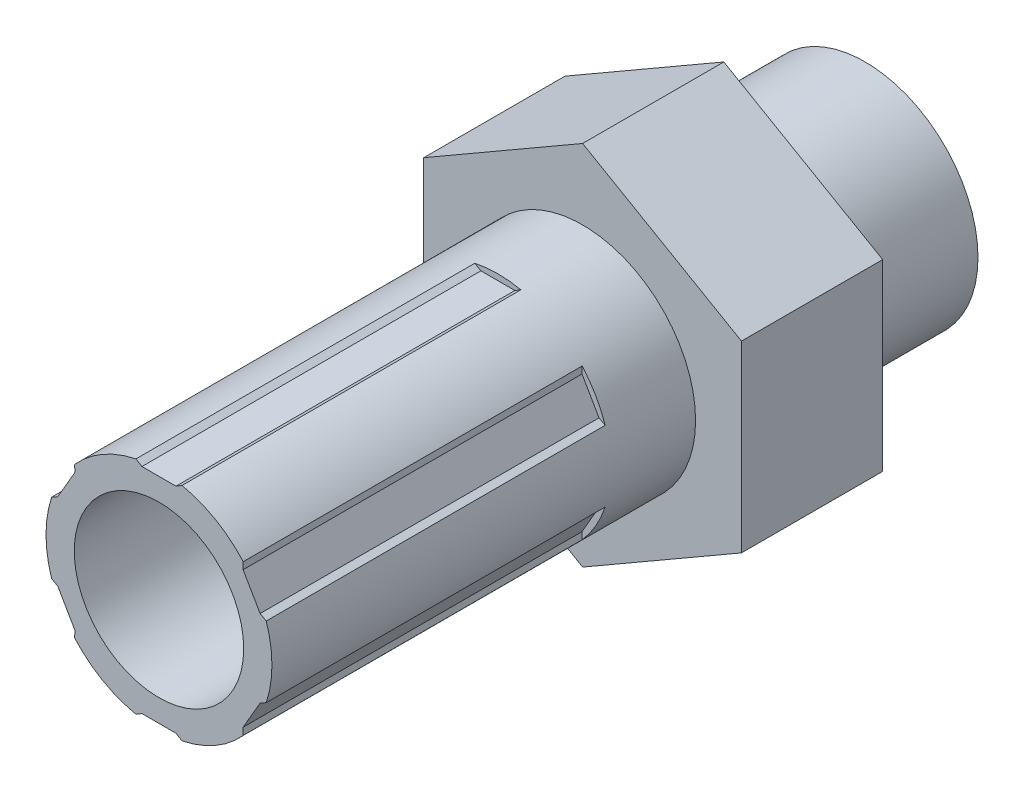
ISO-10303-21;
HEADER;
FILE_DESCRIPTION(('STEP AP214'),'2;1');
FILE_NAME('part.step','',(''),(''),'','','');
FILE_SCHEMA(('AUTOMOTIVE_DESIGN { 1 0 10303 214 1 1 1 1 }'));
ENDSEC;
DATA;
#1=APPLICATION_CONTEXT('core data for automotive mechanical design processes');
#2=APPLICATION_PROTOCOL_DEFINITION('international standard','automotive_design',2000,#1);
#3=PRODUCT_CONTEXT('',#1,'mechanical');
#4=PRODUCT('Part','Part','',(#3));
#5=PRODUCT_RELATED_PRODUCT_CATEGORY('part','',(#4));
#6=PRODUCT_DEFINITION_FORMATION('','',#4);
#7=PRODUCT_DEFINITION_CONTEXT('part definition',#1,'design');
#8=PRODUCT_DEFINITION('design','',#6,#7);
#9=PRODUCT_DEFINITION_SHAPE('','',#8);
#10=(LENGTH_UNIT() NAMED_UNIT(*) SI_UNIT(.MILLI.,.METRE.));
#11=(NAMED_UNIT(*) PLANE_ANGLE_UNIT() SI_UNIT($,.RADIAN.));
#12=(NAMED_UNIT(*) SI_UNIT($,.STERADIAN.) SOLID_ANGLE_UNIT());
#13=UNCERTAINTY_MEASURE_WITH_UNIT(LENGTH_MEASURE(1.E-05),#10,'distance_accuracy_value','');
#14=(GEOMETRIC_REPRESENTATION_CONTEXT(3) GLOBAL_UNCERTAINTY_ASSIGNED_CONTEXT((#13)) GLOBAL_UNIT_ASSIGNED_CONTEXT((#10,
#11,#12)) REPRESENTATION_CONTEXT('',''));
#15=CARTESIAN_POINT('',(0.,0.,0.));
#16=DIRECTION('',(0.,0.,1.));
#17=DIRECTION('',(1.,0.,0.));
#18=AXIS2_PLACEMENT_3D('',#15,#16,#17);
#19=CARTESIAN_POINT('',(0.,8.24889197104678,6.35));
#20=DIRECTION('',(0.,0.,1.));
#21=DIRECTION('',(1.,0.,0.));
#22=AXIS2_PLACEMENT_3D('',#19,#20,#21);
#23=PLANE('',#22);
#24=DIRECTION('',(-0.866025403784439,0.5,0.));
#25=VECTOR('',#24,1.);
#26=CARTESIAN_POINT('',(7.14375,4.12444598552339,6.35));
#27=LINE('',#26,#25);
#28=CARTESIAN_POINT('',(7.14375,4.12444598552339,6.35));
#29=VERTEX_POINT('',#28);
#30=CARTESIAN_POINT('',(0.,8.24889197104678,6.35));
#31=VERTEX_POINT('',#30);
#32=EDGE_CURVE('E386',#29,#31,#27,.T.);
#33=ORIENTED_EDGE('',*,*,#32,.T.);
#34=DIRECTION('',(-0.866025403784438,-0.5,0.));
#35=VECTOR('',#34,1.);
#36=CARTESIAN_POINT('',(0.,8.24889197104678,6.35));
#37=LINE('',#36,#35);
#38=CARTESIAN_POINT('',(-7.14375,4.12444598552338,6.35));
#39=VERTEX_POINT('',#38);
#40=EDGE_CURVE('E389',#31,#39,#37,.T.);
#41=ORIENTED_EDGE('',*,*,#40,.T.);
#42=DIRECTION('',(0.,-1.,0.));
#43=VECTOR('',#42,1.);
#44=CARTESIAN_POINT('',(-7.14375,4.12444598552338,6.35));
#45=LINE('',#44,#43);
#46=CARTESIAN_POINT('',(-7.14375,-4.12444598552339,6.35));
#47=VERTEX_POINT('',#46);
#48=EDGE_CURVE('E392',#39,#47,#45,.T.);
#49=ORIENTED_EDGE('',*,*,#48,.T.);
#50=DIRECTION('',(0.866025403784439,-0.5,0.));
#51=VECTOR('',#50,1.);
#52=CARTESIAN_POINT('',(-7.14375,-4.12444598552339,6.35));
#53=LINE('',#52,#51);
#54=CARTESIAN_POINT('',(0.,-8.24889197104678,6.35));
#55=VERTEX_POINT('',#54);
#56=EDGE_CURVE('E394',#47,#55,#53,.T.);
#57=ORIENTED_EDGE('',*,*,#56,.T.);
#58=DIRECTION('',(0.866025403784439,0.5,0.));
#59=VECTOR('',#58,1.);
#60=CARTESIAN_POINT('',(0.,-8.24889197104678,6.35));
#61=LINE('',#60,#59);
#62=CARTESIAN_POINT('',(7.14375,-4.12444598552339,6.35));
#63=VERTEX_POINT('',#62);
#64=EDGE_CURVE('E396',#55,#63,#61,.T.);
#65=ORIENTED_EDGE('',*,*,#64,.T.);
#66=DIRECTION('',(0.,1.,0.));
#67=VECTOR('',#66,1.);
#68=CARTESIAN_POINT('',(7.14375,-4.12444598552339,6.35));
#69=LINE('',#68,#67);
#70=EDGE_CURVE('E398',#63,#29,#69,.T.);
#71=ORIENTED_EDGE('',*,*,#70,.T.);
#72=EDGE_LOOP('',(#33,#41,#49,#57,#65,#71));
#73=FACE_BOUND('',#72,.T.);
#74=CARTESIAN_POINT('',(0.,0.,6.35));
#75=DIRECTION('',(0.,0.,1.));
#76=DIRECTION('',(1.,0.,0.));
#77=AXIS2_PLACEMENT_3D('',#74,#75,#76);
#78=CIRCLE('',#77,5.08);
#79=CARTESIAN_POINT('',(5.08,0.,6.35));
#80=VERTEX_POINT('',#79);
#81=EDGE_CURVE('E372',#80,#80,#78,.T.);
#82=ORIENTED_EDGE('',*,*,#81,.F.);
#83=EDGE_LOOP('',(#82));
#84=FACE_BOUND('',#83,.T.);
#85=ADVANCED_FACE('F30',(#73,#84),#23,.T.);
#86=CARTESIAN_POINT('',(0.,8.24889197104678,0.));
#87=DIRECTION('',(0.,0.,1.));
#88=DIRECTION('',(1.,0.,0.));
#89=AXIS2_PLACEMENT_3D('',#86,#87,#88);
#90=PLANE('',#89);
#91=DIRECTION('',(-0.866025403784439,0.5,0.));
#92=VECTOR('',#91,1.);
#93=CARTESIAN_POINT('',(7.14375,4.12444598552339,0.));
#94=LINE('',#93,#92);
#95=CARTESIAN_POINT('',(7.14375,4.12444598552339,0.));
#96=VERTEX_POINT('',#95);
#97=CARTESIAN_POINT('',(0.,8.24889197104678,0.));
#98=VERTEX_POINT('',#97);
#99=EDGE_CURVE('E385',#96,#98,#94,.T.);
#100=ORIENTED_EDGE('',*,*,#99,.F.);
#101=DIRECTION('',(0.,1.,0.));
#102=VECTOR('',#101,1.);
#103=CARTESIAN_POINT('',(7.14375,-4.12444598552339,0.));
#104=LINE('',#103,#102);
#105=CARTESIAN_POINT('',(7.14375,-4.12444598552339,0.));
#106=VERTEX_POINT('',#105);
#107=EDGE_CURVE('E390',#106,#96,#104,.T.);
#108=ORIENTED_EDGE('',*,*,#107,.F.);
#109=DIRECTION('',(0.866025403784439,0.5,0.));
#110=VECTOR('',#109,1.);
#111=CARTESIAN_POINT('',(0.,-8.24889197104678,0.));
#112=LINE('',#111,#110);
#113=CARTESIAN_POINT('',(0.,-8.24889197104678,0.));
#114=VERTEX_POINT('',#113);
#115=EDGE_CURVE('E409',#114,#106,#112,.T.);
#116=ORIENTED_EDGE('',*,*,#115,.F.);
#117=DIRECTION('',(0.866025403784439,-0.5,0.));
#118=VECTOR('',#117,1.);
#119=CARTESIAN_POINT('',(-7.14375,-4.12444598552339,0.));
#120=LINE('',#119,#118);
#121=CARTESIAN_POINT('',(-7.14375,-4.12444598552339,0.));
#122=VERTEX_POINT('',#121);
#123=EDGE_CURVE('E407',#122,#114,#120,.T.);
#124=ORIENTED_EDGE('',*,*,#123,.F.);
#125=DIRECTION('',(0.,-1.,0.));
#126=VECTOR('',#125,1.);
#127=CARTESIAN_POINT('',(-7.14375,4.12444598552338,0.));
#128=LINE('',#127,#126);
#129=CARTESIAN_POINT('',(-7.14375,4.12444598552338,0.));
#130=VERTEX_POINT('',#129);
#131=EDGE_CURVE('E405',#130,#122,#128,.T.);
#132=ORIENTED_EDGE('',*,*,#131,.F.);
#133=DIRECTION('',(-0.866025403784438,-0.5,0.));
#134=VECTOR('',#133,1.);
#135=CARTESIAN_POINT('',(0.,8.24889197104678,0.));
#136=LINE('',#135,#134);
#137=EDGE_CURVE('E403',#98,#130,#136,.T.);
#138=ORIENTED_EDGE('',*,*,#137,.F.);
#139=EDGE_LOOP('',(#100,#108,#116,#124,#132,#138));
#140=FACE_BOUND('',#139,.T.);
#141=CARTESIAN_POINT('',(0.,0.,0.));
#142=DIRECTION('',(0.,0.,1.));
#143=DIRECTION('',(1.,0.,0.));
#144=AXIS2_PLACEMENT_3D('',#141,#142,#143);
#145=CIRCLE('',#144,5.08);
#146=CARTESIAN_POINT('',(5.08,0.,0.));
#147=VERTEX_POINT('',#146);
#148=EDGE_CURVE('E429',#147,#147,#145,.F.);
#149=ORIENTED_EDGE('',*,*,#148,.F.);
#150=EDGE_LOOP('',(#149));
#151=FACE_BOUND('',#150,.T.);
#152=ADVANCED_FACE('F536',(#140,#151),#90,.F.);
#153=CARTESIAN_POINT('',(7.14375,4.12444598552339,6.35));
#154=DIRECTION('',(-0.5,-0.866025403784439,0.));
#155=DIRECTION('',(0.866025403784439,-0.5,0.));
#156=AXIS2_PLACEMENT_3D('',#153,#154,#155);
#157=PLANE('',#156);
#158=ORIENTED_EDGE('',*,*,#99,.T.);
#159=DIRECTION('',(0.,0.,-1.));
#160=VECTOR('',#159,1.);
#161=CARTESIAN_POINT('',(0.,8.24889197104678,6.35));
#162=LINE('',#161,#160);
#163=EDGE_CURVE('E426',#31,#98,#162,.T.);
#164=ORIENTED_EDGE('',*,*,#163,.F.);
#165=ORIENTED_EDGE('',*,*,#32,.F.);
#166=DIRECTION('',(0.,0.,-1.));
#167=VECTOR('',#166,1.);
#168=CARTESIAN_POINT('',(7.14375,4.12444598552339,6.35));
#169=LINE('',#168,#167);
#170=EDGE_CURVE('E400',#29,#96,#169,.T.);
#171=ORIENTED_EDGE('',*,*,#170,.T.);
#172=EDGE_LOOP('',(#158,#164,#165,#171));
#173=FACE_BOUND('',#172,.T.);
#174=ADVANCED_FACE('F32',(#173),#157,.F.);
#175=CARTESIAN_POINT('',(0.,8.24889197104678,6.35));
#176=DIRECTION('',(0.5,-0.866025403784438,0.));
#177=DIRECTION('',(0.866025403784438,0.500000000000001,0.));
#178=AXIS2_PLACEMENT_3D('',#175,#176,#177);
#179=PLANE('',#178);
#180=ORIENTED_EDGE('',*,*,#137,.T.);
#181=DIRECTION('',(0.,0.,-1.));
#182=VECTOR('',#181,1.);
#183=CARTESIAN_POINT('',(-7.14375,4.12444598552338,6.35));
#184=LINE('',#183,#182);
#185=EDGE_CURVE('E423',#39,#130,#184,.T.);
#186=ORIENTED_EDGE('',*,*,#185,.F.);
#187=ORIENTED_EDGE('',*,*,#40,.F.);
#188=ORIENTED_EDGE('',*,*,#163,.T.);
#189=EDGE_LOOP('',(#180,#186,#187,#188));
#190=FACE_BOUND('',#189,.T.);
#191=ADVANCED_FACE('F563',(#190),#179,.F.);
#192=CARTESIAN_POINT('',(-7.14375,4.12444598552338,6.35));
#193=DIRECTION('',(1.,0.,0.));
#194=DIRECTION('',(0.,0.,-1.));
#195=AXIS2_PLACEMENT_3D('',#192,#193,#194);
#196=PLANE('',#195);
#197=ORIENTED_EDGE('',*,*,#131,.T.);
#198=DIRECTION('',(0.,0.,-1.));
#199=VECTOR('',#198,1.);
#200=CARTESIAN_POINT('',(-7.14375,-4.12444598552339,6.35));
#201=LINE('',#200,#199);
#202=EDGE_CURVE('E420',#47,#122,#201,.T.);
#203=ORIENTED_EDGE('',*,*,#202,.F.);
#204=ORIENTED_EDGE('',*,*,#48,.F.);
#205=ORIENTED_EDGE('',*,*,#185,.T.);
#206=EDGE_LOOP('',(#197,#203,#204,#205));
#207=FACE_BOUND('',#206,.T.);
#208=ADVANCED_FACE('F560',(#207),#196,.F.);
#209=CARTESIAN_POINT('',(-7.14375,-4.12444598552339,6.35));
#210=DIRECTION('',(0.5,0.866025403784439,0.));
#211=DIRECTION('',(-0.866025403784439,0.5,0.));
#212=AXIS2_PLACEMENT_3D('',#209,#210,#211);
#213=PLANE('',#212);
#214=ORIENTED_EDGE('',*,*,#123,.T.);
#215=DIRECTION('',(0.,0.,-1.));
#216=VECTOR('',#215,1.);
#217=CARTESIAN_POINT('',(0.,-8.24889197104678,6.35));
#218=LINE('',#217,#216);
#219=EDGE_CURVE('E417',#55,#114,#218,.T.);
#220=ORIENTED_EDGE('',*,*,#219,.F.);
#221=ORIENTED_EDGE('',*,*,#56,.F.);
#222=ORIENTED_EDGE('',*,*,#202,.T.);
#223=EDGE_LOOP('',(#214,#220,#221,#222));
#224=FACE_BOUND('',#223,.T.);
#225=ADVANCED_FACE('F556',(#224),#213,.F.);
#226=CARTESIAN_POINT('',(0.,-8.24889197104678,6.35));
#227=DIRECTION('',(-0.5,0.866025403784439,0.));
#228=DIRECTION('',(-0.866025403784439,-0.5,0.));
#229=AXIS2_PLACEMENT_3D('',#226,#227,#228);
#230=PLANE('',#229);
#231=ORIENTED_EDGE('',*,*,#115,.T.);
#232=DIRECTION('',(0.,0.,-1.));
#233=VECTOR('',#232,1.);
#234=CARTESIAN_POINT('',(7.14375,-4.12444598552339,6.35));
#235=LINE('',#234,#233);
#236=EDGE_CURVE('E414',#63,#106,#235,.T.);
#237=ORIENTED_EDGE('',*,*,#236,.F.);
#238=ORIENTED_EDGE('',*,*,#64,.F.);
#239=ORIENTED_EDGE('',*,*,#219,.T.);
#240=EDGE_LOOP('',(#231,#237,#238,#239));
#241=FACE_BOUND('',#240,.T.);
#242=ADVANCED_FACE('F552',(#241),#230,.F.);
#243=CARTESIAN_POINT('',(7.14375,-4.12444598552339,6.35));
#244=DIRECTION('',(-1.,0.,0.));
#245=DIRECTION('',(0.,-1.,0.));
#246=AXIS2_PLACEMENT_3D('',#243,#244,#245);
#247=PLANE('',#246);
#248=ORIENTED_EDGE('',*,*,#107,.T.);
#249=ORIENTED_EDGE('',*,*,#170,.F.);
#250=ORIENTED_EDGE('',*,*,#70,.F.);
#251=ORIENTED_EDGE('',*,*,#236,.T.);
#252=EDGE_LOOP('',(#248,#249,#250,#251));
#253=FACE_BOUND('',#252,.T.);
#254=ADVANCED_FACE('F549',(#253),#247,.F.);
#255=CARTESIAN_POINT('',(0.,0.,-6.35));
#256=DIRECTION('',(0.,0.,1.));
#257=DIRECTION('',(1.,0.,0.));
#258=AXIS2_PLACEMENT_3D('',#255,#256,#257);
#259=CYLINDRICAL_SURFACE('',#258,5.08);
#260=CARTESIAN_POINT('',(0.,0.,-6.35));
#261=DIRECTION('',(0.,0.,-1.));
#262=DIRECTION('',(-1.,0.,0.));
#263=AXIS2_PLACEMENT_3D('',#260,#261,#262);
#264=CIRCLE('',#263,5.08);
#265=CARTESIAN_POINT('',(-5.08,0.,-6.35));
#266=VERTEX_POINT('',#265);
#267=EDGE_CURVE('E378',#266,#266,#264,.T.);
#268=ORIENTED_EDGE('',*,*,#267,.F.);
#269=EDGE_LOOP('',(#268));
#270=FACE_BOUND('',#269,.T.);
#271=ORIENTED_EDGE('',*,*,#148,.T.);
#272=EDGE_LOOP('',(#271));
#273=FACE_BOUND('',#272,.T.);
#274=ADVANCED_FACE('F546',(#270,#273),#259,.T.);
#275=CARTESIAN_POINT('',(0.,0.,-6.35));
#276=DIRECTION('',(0.,0.,-1.));
#277=DIRECTION('',(-1.,0.,0.));
#278=AXIS2_PLACEMENT_3D('',#275,#276,#277);
#279=PLANE('',#278);
#280=CARTESIAN_POINT('',(0.,0.,-6.35));
#281=DIRECTION('',(0.,0.,1.));
#282=DIRECTION('',(1.,0.,0.));
#283=AXIS2_PLACEMENT_3D('',#280,#281,#282);
#284=CIRCLE('',#283,3.81);
#285=CARTESIAN_POINT('',(3.81,0.,-6.35));
#286=VERTEX_POINT('',#285);
#287=EDGE_CURVE('E369',#286,#286,#284,.T.);
#288=ORIENTED_EDGE('',*,*,#287,.T.);
#289=EDGE_LOOP('',(#288));
#290=FACE_BOUND('',#289,.T.);
#291=ORIENTED_EDGE('',*,*,#267,.T.);
#292=EDGE_LOOP('',(#291));
#293=FACE_BOUND('',#292,.T.);
#294=ADVANCED_FACE('F591',(#290,#293),#279,.T.);
#295=CARTESIAN_POINT('',(0.,0.,25.4));
#296=DIRECTION('',(0.,0.,-1.));
#297=DIRECTION('',(-1.,0.,0.));
#298=AXIS2_PLACEMENT_3D('',#295,#296,#297);
#299=CYLINDRICAL_SURFACE('',#298,5.08);
#300=CARTESIAN_POINT('',(0.,0.,25.4));
#301=DIRECTION('',(0.,0.,1.));
#302=DIRECTION('',(1.,0.,0.));
#303=AXIS2_PLACEMENT_3D('',#300,#301,#302);
#304=CIRCLE('',#303,5.08);
#305=CARTESIAN_POINT('',(3.78960210015848,3.38309265650151,25.4));
#306=VERTEX_POINT('',#305);
#307=CARTESIAN_POINT('',(1.03504313380759,4.97343801722287,25.4));
#308=VERTEX_POINT('',#307);
#309=EDGE_CURVE('E380',#306,#308,#304,.T.);
#310=ORIENTED_EDGE('',*,*,#309,.F.);
#311=DIRECTION('',(0.,0.,-1.));
#312=VECTOR('',#311,1.);
#313=CARTESIAN_POINT('',(3.78960210015848,3.38309265650151,25.4));
#314=LINE('',#313,#312);
#315=CARTESIAN_POINT('',(3.78960210015848,3.38309265650151,10.16));
#316=VERTEX_POINT('',#315);
#317=EDGE_CURVE('E256',#306,#316,#314,.T.);
#318=ORIENTED_EDGE('',*,*,#317,.T.);
#319=CARTESIAN_POINT('',(0.,0.,10.16));
#320=DIRECTION('',(0.,0.,-1.));
#321=DIRECTION('',(-1.,0.,0.));
#322=AXIS2_PLACEMENT_3D('',#319,#320,#321);
#323=CIRCLE('',#322,5.08);
#324=CARTESIAN_POINT('',(4.82464523396609,1.59034536072146,10.16));
#325=VERTEX_POINT('',#324);
#326=EDGE_CURVE('E11',#316,#325,#323,.T.);
#327=ORIENTED_EDGE('',*,*,#326,.T.);
#328=DIRECTION('',(0.,0.,-1.));
#329=VECTOR('',#328,1.);
#330=CARTESIAN_POINT('',(4.82464523396609,1.59034536072146,25.4));
#331=LINE('',#330,#329);
#332=CARTESIAN_POINT('',(4.82464523396609,1.59034536072146,25.4));
#333=VERTEX_POINT('',#332);
#334=EDGE_CURVE('E248',#325,#333,#331,.F.);
#335=ORIENTED_EDGE('',*,*,#334,.T.);
#336=CARTESIAN_POINT('',(4.82464523396613,-1.59034536072136,25.4));
#337=VERTEX_POINT('',#336);
#338=EDGE_CURVE('E470',#337,#333,#304,.T.);
#339=ORIENTED_EDGE('',*,*,#338,.F.);
#340=DIRECTION('',(0.,0.,-1.));
#341=VECTOR('',#340,1.);
#342=CARTESIAN_POINT('',(4.82464523396613,-1.59034536072136,25.4));
#343=LINE('',#342,#341);
#344=CARTESIAN_POINT('',(4.82464523396613,-1.59034536072136,10.16));
#345=VERTEX_POINT('',#344);
#346=EDGE_CURVE('E276',#337,#345,#343,.T.);
#347=ORIENTED_EDGE('',*,*,#346,.T.);
#348=CARTESIAN_POINT('',(0.,0.,10.16));
#349=DIRECTION('',(0.,0.,-1.));
#350=DIRECTION('',(-1.,0.,0.));
#351=AXIS2_PLACEMENT_3D('',#348,#349,#350);
#352=CIRCLE('',#351,5.08);
#353=CARTESIAN_POINT('',(3.78960210015855,-3.38309265650143,10.16));
#354=VERTEX_POINT('',#353);
#355=EDGE_CURVE('E458',#345,#354,#352,.T.);
#356=ORIENTED_EDGE('',*,*,#355,.T.);
#357=DIRECTION('',(0.,0.,-1.));
#358=VECTOR('',#357,1.);
#359=CARTESIAN_POINT('',(3.78960210015855,-3.38309265650143,25.4));
#360=LINE('',#359,#358);
#361=CARTESIAN_POINT('',(3.78960210015855,-3.38309265650143,25.4));
#362=VERTEX_POINT('',#361);
#363=EDGE_CURVE('E272',#354,#362,#360,.F.);
#364=ORIENTED_EDGE('',*,*,#363,.T.);
#365=CARTESIAN_POINT('',(1.0350431338076,-4.97343801722287,25.4));
#366=VERTEX_POINT('',#365);
#367=EDGE_CURVE('E475',#366,#362,#304,.T.);
#368=ORIENTED_EDGE('',*,*,#367,.F.);
#369=DIRECTION('',(0.,0.,-1.));
#370=VECTOR('',#369,1.);
#371=CARTESIAN_POINT('',(1.0350431338076,-4.97343801722287,25.4));
#372=LINE('',#371,#370);
#373=CARTESIAN_POINT('',(1.0350431338076,-4.97343801722287,10.16));
#374=VERTEX_POINT('',#373);
#375=EDGE_CURVE('E298',#366,#374,#372,.T.);
#376=ORIENTED_EDGE('',*,*,#375,.T.);
#377=CARTESIAN_POINT('',(0.,0.,10.16));
#378=DIRECTION('',(0.,0.,-1.));
#379=DIRECTION('',(-1.,0.,0.));
#380=AXIS2_PLACEMENT_3D('',#377,#378,#379);
#381=CIRCLE('',#380,5.08);
#382=CARTESIAN_POINT('',(-1.03504313380759,-4.97343801722287,10.16));
#383=VERTEX_POINT('',#382);
#384=EDGE_CURVE('E453',#374,#383,#381,.T.);
#385=ORIENTED_EDGE('',*,*,#384,.T.);
#386=DIRECTION('',(0.,0.,-1.));
#387=VECTOR('',#386,1.);
#388=CARTESIAN_POINT('',(-1.03504313380759,-4.97343801722287,25.4));
#389=LINE('',#388,#387);
#390=CARTESIAN_POINT('',(-1.03504313380759,-4.97343801722287,25.4));
#391=VERTEX_POINT('',#390);
#392=EDGE_CURVE('E294',#383,#391,#389,.F.);
#393=ORIENTED_EDGE('',*,*,#392,.T.);
#394=CARTESIAN_POINT('',(-3.7896021001585,-3.38309265650149,25.4));
#395=VERTEX_POINT('',#394);
#396=EDGE_CURVE('E477',#395,#391,#304,.T.);
#397=ORIENTED_EDGE('',*,*,#396,.F.);
#398=DIRECTION('',(0.,0.,-1.));
#399=VECTOR('',#398,1.);
#400=CARTESIAN_POINT('',(-3.7896021001585,-3.38309265650148,25.4));
#401=LINE('',#400,#399);
#402=CARTESIAN_POINT('',(-3.7896021001585,-3.38309265650149,10.16));
#403=VERTEX_POINT('',#402);
#404=EDGE_CURVE('E320',#395,#403,#401,.T.);
#405=ORIENTED_EDGE('',*,*,#404,.T.);
#406=CARTESIAN_POINT('',(0.,0.,10.16));
#407=DIRECTION('',(0.,0.,-1.));
#408=DIRECTION('',(-1.,0.,0.));
#409=AXIS2_PLACEMENT_3D('',#406,#407,#408);
#410=CIRCLE('',#409,5.08);
#411=CARTESIAN_POINT('',(-4.8246452339661,-1.59034536072143,10.16));
#412=VERTEX_POINT('',#411);
#413=EDGE_CURVE('E447',#403,#412,#410,.T.);
#414=ORIENTED_EDGE('',*,*,#413,.T.);
#415=DIRECTION('',(0.,0.,-1.));
#416=VECTOR('',#415,1.);
#417=CARTESIAN_POINT('',(-4.8246452339661,-1.59034536072143,25.4));
#418=LINE('',#417,#416);
#419=CARTESIAN_POINT('',(-4.8246452339661,-1.59034536072143,25.4));
#420=VERTEX_POINT('',#419);
#421=EDGE_CURVE('E316',#412,#420,#418,.F.);
#422=ORIENTED_EDGE('',*,*,#421,.T.);
#423=CARTESIAN_POINT('',(-4.82464523396612,1.59034536072139,25.4));
#424=VERTEX_POINT('',#423);
#425=EDGE_CURVE('E379',#424,#420,#304,.T.);
#426=ORIENTED_EDGE('',*,*,#425,.F.);
#427=DIRECTION('',(0.,0.,-1.));
#428=VECTOR('',#427,1.);
#429=CARTESIAN_POINT('',(-4.82464523396612,1.59034536072139,25.4));
#430=LINE('',#429,#428);
#431=CARTESIAN_POINT('',(-4.82464523396612,1.59034536072139,10.16));
#432=VERTEX_POINT('',#431);
#433=EDGE_CURVE('E342',#424,#432,#430,.T.);
#434=ORIENTED_EDGE('',*,*,#433,.T.);
#435=CARTESIAN_POINT('',(0.,0.,10.16));
#436=DIRECTION('',(0.,0.,-1.));
#437=DIRECTION('',(-1.,0.,0.));
#438=AXIS2_PLACEMENT_3D('',#435,#436,#437);
#439=CIRCLE('',#438,5.08);
#440=CARTESIAN_POINT('',(-3.78960210015852,3.38309265650146,10.16));
#441=VERTEX_POINT('',#440);
#442=EDGE_CURVE('E441',#432,#441,#439,.T.);
#443=ORIENTED_EDGE('',*,*,#442,.T.);
#444=DIRECTION('',(0.,0.,-1.));
#445=VECTOR('',#444,1.);
#446=CARTESIAN_POINT('',(-3.78960210015852,3.38309265650146,25.4));
#447=LINE('',#446,#445);
#448=CARTESIAN_POINT('',(-3.78960210015852,3.38309265650146,25.4));
#449=VERTEX_POINT('',#448);
#450=EDGE_CURVE('E338',#441,#449,#447,.F.);
#451=ORIENTED_EDGE('',*,*,#450,.T.);
#452=CARTESIAN_POINT('',(-1.0350431338076,4.97343801722287,25.4));
#453=VERTEX_POINT('',#452);
#454=EDGE_CURVE('E375',#453,#449,#304,.T.);
#455=ORIENTED_EDGE('',*,*,#454,.F.);
#456=DIRECTION('',(0.,0.,-1.));
#457=VECTOR('',#456,1.);
#458=CARTESIAN_POINT('',(-1.0350431338076,4.97343801722287,25.4));
#459=LINE('',#458,#457);
#460=CARTESIAN_POINT('',(-1.0350431338076,4.97343801722287,10.16));
#461=VERTEX_POINT('',#460);
#462=EDGE_CURVE('E365',#453,#461,#459,.T.);
#463=ORIENTED_EDGE('',*,*,#462,.T.);
#464=CARTESIAN_POINT('',(0.,0.,10.16));
#465=DIRECTION('',(0.,0.,-1.));
#466=DIRECTION('',(-1.,0.,0.));
#467=AXIS2_PLACEMENT_3D('',#464,#465,#466);
#468=CIRCLE('',#467,5.08);
#469=CARTESIAN_POINT('',(1.03504313380759,4.97343801722287,10.16));
#470=VERTEX_POINT('',#469);
#471=EDGE_CURVE('E435',#461,#470,#468,.T.);
#472=ORIENTED_EDGE('',*,*,#471,.T.);
#473=DIRECTION('',(0.,0.,-1.));
#474=VECTOR('',#473,1.);
#475=CARTESIAN_POINT('',(1.03504313380759,4.97343801722287,25.4));
#476=LINE('',#475,#474);
#477=EDGE_CURVE('E361',#470,#308,#476,.F.);
#478=ORIENTED_EDGE('',*,*,#477,.T.);
#479=EDGE_LOOP('',(#310,#318,#327,#335,#339,#347,#356,#364,#368,#376,#385,#393,#397,#405,#414,
#422,#426,#434,#443,#451,#455,#463,#472,#478));
#480=FACE_BOUND('',#479,.T.);
#481=ORIENTED_EDGE('',*,*,#81,.T.);
#482=EDGE_LOOP('',(#481));
#483=FACE_BOUND('',#482,.T.);
#484=ADVANCED_FACE('F472',(#480,#483),#299,.T.);
#485=CARTESIAN_POINT('',(0.,0.,25.4));
#486=DIRECTION('',(0.,0.,1.));
#487=DIRECTION('',(1.,0.,0.));
#488=AXIS2_PLACEMENT_3D('',#485,#486,#487);
#489=PLANE('',#488);
#490=DIRECTION('',(-0.0182480021958293,-0.999833491345364,0.));
#491=VECTOR('',#490,1.);
#492=CARTESIAN_POINT('',(3.72661579926544,-0.0680146183105983,25.4));
#493=LINE('',#492,#491);
#494=CARTESIAN_POINT('',(3.78385145208478,3.06800662794245,25.4));
#495=VERTEX_POINT('',#494);
#496=EDGE_CURVE('E38',#306,#495,#493,.T.);
#497=ORIENTED_EDGE('',*,*,#496,.F.);
#498=ORIENTED_EDGE('',*,*,#309,.T.);
#499=DIRECTION('',(0.856757201961654,0.515719979142595,0.));
#500=VECTOR('',#499,1.);
#501=CARTESIAN_POINT('',(0.765045952734751,4.81091479562329,25.4));
#502=LINE('',#501,#500);
#503=CARTESIAN_POINT('',(0.765045952734751,4.81091479562329,25.4));
#504=VERTEX_POINT('',#503);
#505=EDGE_CURVE('E349',#504,#308,#502,.T.);
#506=ORIENTED_EDGE('',*,*,#505,.F.);
#507=DIRECTION('',(1.,0.,0.));
#508=VECTOR('',#507,1.);
#509=CARTESIAN_POINT('',(0.,4.81091479562329,25.4));
#510=LINE('',#509,#508);
#511=CARTESIAN_POINT('',(-0.765045952734751,4.81091479562329,25.4));
#512=VERTEX_POINT('',#511);
#513=EDGE_CURVE('E345',#512,#504,#510,.T.);
#514=ORIENTED_EDGE('',*,*,#513,.F.);
#515=DIRECTION('',(0.856757201961654,-0.515719979142595,0.));
#516=VECTOR('',#515,1.);
#517=CARTESIAN_POINT('',(1.92221028691844,3.193336643153,25.4));
#518=LINE('',#517,#516);
#519=EDGE_CURVE('E432',#453,#512,#518,.T.);
#520=ORIENTED_EDGE('',*,*,#519,.F.);
#521=ORIENTED_EDGE('',*,*,#454,.T.);
#522=DIRECTION('',(-0.0182480021958435,0.999833491345364,0.));
#523=VECTOR('',#522,1.);
#524=CARTESIAN_POINT('',(-3.78385145208483,3.0680066279424,25.4));
#525=LINE('',#524,#523);
#526=CARTESIAN_POINT('',(-3.78385145208483,3.0680066279424,25.4));
#527=VERTEX_POINT('',#526);
#528=EDGE_CURVE('E327',#527,#449,#525,.T.);
#529=ORIENTED_EDGE('',*,*,#528,.F.);
#530=DIRECTION('',(0.499999999999998,0.86602540378444,0.));
#531=VECTOR('',#530,1.);
#532=CARTESIAN_POINT('',(-4.1663744284522,2.40545739781164,25.4));
#533=LINE('',#532,#531);
#534=CARTESIAN_POINT('',(-4.54889740481957,1.74290816768087,25.4));
#535=VERTEX_POINT('',#534);
#536=EDGE_CURVE('E323',#535,#527,#533,.T.);
#537=ORIENTED_EDGE('',*,*,#536,.F.);
#538=DIRECTION('',(0.875005204157493,0.484113512202772,0.));
#539=VECTOR('',#538,1.);
#540=CARTESIAN_POINT('',(-1.80440551234701,3.26135126146364,25.4));
#541=LINE('',#540,#539);
#542=EDGE_CURVE('E438',#424,#535,#541,.T.);
#543=ORIENTED_EDGE('',*,*,#542,.F.);
#544=ORIENTED_EDGE('',*,*,#425,.T.);
#545=DIRECTION('',(-0.875005204157497,0.484113512202765,0.));
#546=VECTOR('',#545,1.);
#547=CARTESIAN_POINT('',(-4.54889740481956,-1.74290816768091,25.4));
#548=LINE('',#547,#546);
#549=CARTESIAN_POINT('',(-4.54889740481956,-1.74290816768091,25.4));
#550=VERTEX_POINT('',#549);
#551=EDGE_CURVE('E305',#550,#420,#548,.T.);
#552=ORIENTED_EDGE('',*,*,#551,.F.);
#553=DIRECTION('',(-0.500000000000004,0.866025403784436,0.));
#554=VECTOR('',#553,1.);
#555=CARTESIAN_POINT('',(-4.16637442845218,-2.40545739781167,25.4));
#556=LINE('',#555,#554);
#557=CARTESIAN_POINT('',(-3.78385145208481,-3.06800662794243,25.4));
#558=VERTEX_POINT('',#557);
#559=EDGE_CURVE('E301',#558,#550,#556,.T.);
#560=ORIENTED_EDGE('',*,*,#559,.F.);
#561=DIRECTION('',(0.0182480021958363,0.999833491345364,0.));
#562=VECTOR('',#561,1.);
#563=CARTESIAN_POINT('',(-3.72661579926544,0.0680146183106246,25.4));
#564=LINE('',#563,#562);
#565=EDGE_CURVE('E444',#395,#558,#564,.T.);
#566=ORIENTED_EDGE('',*,*,#565,.F.);
#567=ORIENTED_EDGE('',*,*,#396,.T.);
#568=DIRECTION('',(-0.856757201961654,-0.515719979142595,0.));
#569=VECTOR('',#568,1.);
#570=CARTESIAN_POINT('',(-0.765045952734751,-4.81091479562329,25.4));
#571=LINE('',#570,#569);
#572=CARTESIAN_POINT('',(-0.765045952734751,-4.81091479562329,25.4));
#573=VERTEX_POINT('',#572);
#574=EDGE_CURVE('E283',#573,#391,#571,.T.);
#575=ORIENTED_EDGE('',*,*,#574,.F.);
#576=DIRECTION('',(-1.,0.,0.));
#577=VECTOR('',#576,1.);
#578=CARTESIAN_POINT('',(0.,-4.81091479562329,25.4));
#579=LINE('',#578,#577);
#580=CARTESIAN_POINT('',(0.765045952734751,-4.81091479562329,25.4));
#581=VERTEX_POINT('',#580);
#582=EDGE_CURVE('E279',#581,#573,#579,.T.);
#583=ORIENTED_EDGE('',*,*,#582,.F.);
#584=DIRECTION('',(-0.856757201961654,0.515719979142595,0.));
#585=VECTOR('',#584,1.);
#586=CARTESIAN_POINT('',(-1.92221028691844,-3.193336643153,25.4));
#587=LINE('',#586,#585);
#588=EDGE_CURVE('E450',#366,#581,#587,.T.);
#589=ORIENTED_EDGE('',*,*,#588,.F.);
#590=ORIENTED_EDGE('',*,*,#367,.T.);
#591=DIRECTION('',(0.0182480021958505,-0.999833491345364,0.));
#592=VECTOR('',#591,1.);
#593=CARTESIAN_POINT('',(3.78385145208485,-3.06800662794238,25.4));
#594=LINE('',#593,#592);
#595=CARTESIAN_POINT('',(3.78385145208485,-3.06800662794238,25.4));
#596=VERTEX_POINT('',#595);
#597=EDGE_CURVE('E263',#596,#362,#594,.T.);
#598=ORIENTED_EDGE('',*,*,#597,.F.);
#599=DIRECTION('',(-0.499999999999992,-0.866025403784443,0.));
#600=VECTOR('',#599,1.);
#601=CARTESIAN_POINT('',(4.16637442845222,-2.40545739781161,25.4));
#602=LINE('',#601,#600);
#603=CARTESIAN_POINT('',(4.54889740481959,-1.74290816768084,25.4));
#604=VERTEX_POINT('',#603);
#605=EDGE_CURVE('E259',#604,#596,#602,.T.);
#606=ORIENTED_EDGE('',*,*,#605,.F.);
#607=DIRECTION('',(-0.87500520415749,-0.484113512202778,0.));
#608=VECTOR('',#607,1.);
#609=CARTESIAN_POINT('',(1.80440551234703,-3.26135126146363,25.4));
#610=LINE('',#609,#608);
#611=EDGE_CURVE('E456',#337,#604,#610,.T.);
#612=ORIENTED_EDGE('',*,*,#611,.F.);
#613=ORIENTED_EDGE('',*,*,#338,.T.);
#614=DIRECTION('',(0.8750052041575,-0.484113512202759,0.));
#615=VECTOR('',#614,1.);
#616=CARTESIAN_POINT('',(4.54889740481955,1.74290816768094,25.4));
#617=LINE('',#616,#615);
#618=CARTESIAN_POINT('',(4.54889740481955,1.74290816768094,25.4));
#619=VERTEX_POINT('',#618);
#620=EDGE_CURVE('E237',#619,#333,#617,.T.);
#621=ORIENTED_EDGE('',*,*,#620,.F.);
#622=DIRECTION('',(0.50000000000001,-0.866025403784433,0.));
#623=VECTOR('',#622,1.);
#624=CARTESIAN_POINT('',(4.16637442845217,2.4054573978117,25.4));
#625=LINE('',#624,#623);
#626=EDGE_CURVE('E242',#495,#619,#625,.T.);
#627=ORIENTED_EDGE('',*,*,#626,.F.);
#628=EDGE_LOOP('',(#497,#498,#506,#514,#520,#521,#529,#537,#543,#544,#552,#560,#566,#567,#575,
#583,#589,#590,#598,#606,#612,#613,#621,#627));
#629=FACE_BOUND('',#628,.T.);
#630=CARTESIAN_POINT('',(0.,0.,25.4));
#631=DIRECTION('',(0.,0.,1.));
#632=DIRECTION('',(1.,0.,0.));
#633=AXIS2_PLACEMENT_3D('',#630,#631,#632);
#634=CIRCLE('',#633,3.81);
#635=CARTESIAN_POINT('',(3.81,0.,25.4));
#636=VERTEX_POINT('',#635);
#637=EDGE_CURVE('E368',#636,#636,#634,.T.);
#638=ORIENTED_EDGE('',*,*,#637,.F.);
#639=EDGE_LOOP('',(#638));
#640=FACE_BOUND('',#639,.T.);
#641=ADVANCED_FACE('F465',(#629,#640),#489,.T.);
#642=CARTESIAN_POINT('',(0.,0.,-6.35));
#643=DIRECTION('',(0.,0.,1.));
#644=DIRECTION('',(1.,0.,0.));
#645=AXIS2_PLACEMENT_3D('',#642,#643,#644);
#646=CYLINDRICAL_SURFACE('',#645,3.81);
#647=ORIENTED_EDGE('',*,*,#287,.F.);
#648=EDGE_LOOP('',(#647));
#649=FACE_BOUND('',#648,.T.);
#650=ORIENTED_EDGE('',*,*,#637,.T.);
#651=EDGE_LOOP('',(#650));
#652=FACE_BOUND('',#651,.T.);
#653=ADVANCED_FACE('F606',(#649,#652),#646,.F.);
#654=CARTESIAN_POINT('',(-0.765045952734751,4.81091479562329,10.16));
#655=DIRECTION('',(0.,0.,-1.));
#656=DIRECTION('',(-1.,0.,0.));
#657=AXIS2_PLACEMENT_3D('',#654,#655,#656);
#658=PLANE('',#657);
#659=DIRECTION('',(0.856757201961654,-0.515719979142595,0.));
#660=VECTOR('',#659,1.);
#661=CARTESIAN_POINT('',(-0.765045952734751,4.81091479562329,10.16));
#662=LINE('',#661,#660);
#663=CARTESIAN_POINT('',(-0.765045952734751,4.81091479562329,10.16));
#664=VERTEX_POINT('',#663);
#665=EDGE_CURVE('E352',#461,#664,#662,.T.);
#666=ORIENTED_EDGE('',*,*,#665,.T.);
#667=DIRECTION('',(1.,0.,0.));
#668=VECTOR('',#667,1.);
#669=CARTESIAN_POINT('',(0.,4.81091479562329,10.16));
#670=LINE('',#669,#668);
#671=CARTESIAN_POINT('',(0.765045952734751,4.81091479562329,10.16));
#672=VERTEX_POINT('',#671);
#673=EDGE_CURVE('E346',#664,#672,#670,.T.);
#674=ORIENTED_EDGE('',*,*,#673,.T.);
#675=DIRECTION('',(0.856757201961654,0.515719979142595,0.));
#676=VECTOR('',#675,1.);
#677=CARTESIAN_POINT('',(0.765045952734751,4.81091479562329,10.16));
#678=LINE('',#677,#676);
#679=EDGE_CURVE('E348',#672,#470,#678,.T.);
#680=ORIENTED_EDGE('',*,*,#679,.T.);
#681=ORIENTED_EDGE('',*,*,#471,.F.);
#682=EDGE_LOOP('',(#666,#674,#680,#681));
#683=FACE_BOUND('',#682,.T.);
#684=ADVANCED_FACE('F609',(#683),#658,.F.);
#685=CARTESIAN_POINT('',(-0.765045952734751,4.81091479562329,10.16));
#686=DIRECTION('',(-0.515719979142595,-0.856757201961654,0.));
#687=DIRECTION('',(0.856757201961654,-0.515719979142595,0.));
#688=AXIS2_PLACEMENT_3D('',#685,#686,#687);
#689=PLANE('',#688);
#690=ORIENTED_EDGE('',*,*,#519,.T.);
#691=DIRECTION('',(0.,0.,1.));
#692=VECTOR('',#691,1.);
#693=CARTESIAN_POINT('',(-0.765045952734751,4.81091479562329,10.16));
#694=LINE('',#693,#692);
#695=EDGE_CURVE('E359',#664,#512,#694,.T.);
#696=ORIENTED_EDGE('',*,*,#695,.F.);
#697=ORIENTED_EDGE('',*,*,#665,.F.);
#698=ORIENTED_EDGE('',*,*,#462,.F.);
#699=EDGE_LOOP('',(#690,#696,#697,#698));
#700=FACE_BOUND('',#699,.T.);
#701=ADVANCED_FACE('F619',(#700),#689,.F.);
#702=CARTESIAN_POINT('',(0.765045952734751,4.81091479562329,10.16));
#703=DIRECTION('',(0.515719979142595,-0.856757201961654,0.));
#704=DIRECTION('',(0.856757201961654,0.515719979142595,0.));
#705=AXIS2_PLACEMENT_3D('',#702,#703,#704);
#706=PLANE('',#705);
#707=ORIENTED_EDGE('',*,*,#679,.F.);
#708=DIRECTION('',(0.,0.,1.));
#709=VECTOR('',#708,1.);
#710=CARTESIAN_POINT('',(0.765045952734751,4.81091479562329,10.16));
#711=LINE('',#710,#709);
#712=EDGE_CURVE('E354',#672,#504,#711,.T.);
#713=ORIENTED_EDGE('',*,*,#712,.T.);
#714=ORIENTED_EDGE('',*,*,#505,.T.);
#715=ORIENTED_EDGE('',*,*,#477,.F.);
#716=EDGE_LOOP('',(#707,#713,#714,#715));
#717=FACE_BOUND('',#716,.T.);
#718=ADVANCED_FACE('F615',(#717),#706,.F.);
#719=CARTESIAN_POINT('',(0.,4.81091479562329,10.16));
#720=DIRECTION('',(0.,-1.,0.));
#721=DIRECTION('',(0.,0.,-1.));
#722=AXIS2_PLACEMENT_3D('',#719,#720,#721);
#723=PLANE('',#722);
#724=ORIENTED_EDGE('',*,*,#513,.T.);
#725=ORIENTED_EDGE('',*,*,#712,.F.);
#726=ORIENTED_EDGE('',*,*,#673,.F.);
#727=ORIENTED_EDGE('',*,*,#695,.T.);
#728=EDGE_LOOP('',(#724,#725,#726,#727));
#729=FACE_BOUND('',#728,.T.);
#730=ADVANCED_FACE('F611',(#729),#723,.F.);
#731=CARTESIAN_POINT('',(-4.54889740481957,1.74290816768087,10.16));
#732=DIRECTION('',(0.,0.,-1.));
#733=DIRECTION('',(-0.499999999999998,-0.86602540378444,0.));
#734=AXIS2_PLACEMENT_3D('',#731,#732,#733);
#735=PLANE('',#734);
#736=DIRECTION('',(0.875005204157493,0.484113512202772,0.));
#737=VECTOR('',#736,1.);
#738=CARTESIAN_POINT('',(-4.54889740481957,1.74290816768087,10.16));
#739=LINE('',#738,#737);
#740=CARTESIAN_POINT('',(-4.54889740481957,1.74290816768087,10.16));
#741=VERTEX_POINT('',#740);
#742=EDGE_CURVE('E330',#432,#741,#739,.T.);
#743=ORIENTED_EDGE('',*,*,#742,.T.);
#744=DIRECTION('',(0.499999999999997,0.86602540378444,0.));
#745=VECTOR('',#744,1.);
#746=CARTESIAN_POINT('',(-4.1663744284522,2.40545739781164,10.16));
#747=LINE('',#746,#745);
#748=CARTESIAN_POINT('',(-3.78385145208483,3.0680066279424,10.16));
#749=VERTEX_POINT('',#748);
#750=EDGE_CURVE('E324',#741,#749,#747,.T.);
#751=ORIENTED_EDGE('',*,*,#750,.T.);
#752=DIRECTION('',(-0.0182480021958435,0.999833491345364,0.));
#753=VECTOR('',#752,1.);
#754=CARTESIAN_POINT('',(-3.78385145208483,3.0680066279424,10.16));
#755=LINE('',#754,#753);
#756=EDGE_CURVE('E326',#749,#441,#755,.T.);
#757=ORIENTED_EDGE('',*,*,#756,.T.);
#758=ORIENTED_EDGE('',*,*,#442,.F.);
#759=EDGE_LOOP('',(#743,#751,#757,#758));
#760=FACE_BOUND('',#759,.T.);
#761=ADVANCED_FACE('F614',(#760),#735,.F.);
#762=CARTESIAN_POINT('',(-4.54889740481957,1.74290816768087,10.16));
#763=DIRECTION('',(0.484113512202772,-0.875005204157493,0.));
#764=DIRECTION('',(0.875005204157493,0.484113512202772,0.));
#765=AXIS2_PLACEMENT_3D('',#762,#763,#764);
#766=PLANE('',#765);
#767=ORIENTED_EDGE('',*,*,#542,.T.);
#768=DIRECTION('',(0.,0.,1.));
#769=VECTOR('',#768,1.);
#770=CARTESIAN_POINT('',(-4.54889740481957,1.74290816768087,10.16));
#771=LINE('',#770,#769);
#772=EDGE_CURVE('E336',#741,#535,#771,.T.);
#773=ORIENTED_EDGE('',*,*,#772,.F.);
#774=ORIENTED_EDGE('',*,*,#742,.F.);
#775=ORIENTED_EDGE('',*,*,#433,.F.);
#776=EDGE_LOOP('',(#767,#773,#774,#775));
#777=FACE_BOUND('',#776,.T.);
#778=ADVANCED_FACE('F634',(#777),#766,.F.);
#779=CARTESIAN_POINT('',(-3.78385145208483,3.0680066279424,10.16));
#780=DIRECTION('',(0.999833491345364,0.0182480021958435,0.));
#781=DIRECTION('',(-0.0182480021958435,0.999833491345364,0.));
#782=AXIS2_PLACEMENT_3D('',#779,#780,#781);
#783=PLANE('',#782);
#784=ORIENTED_EDGE('',*,*,#756,.F.);
#785=DIRECTION('',(0.,0.,1.));
#786=VECTOR('',#785,1.);
#787=CARTESIAN_POINT('',(-3.78385145208483,3.0680066279424,10.16));
#788=LINE('',#787,#786);
#789=EDGE_CURVE('E332',#749,#527,#788,.T.);
#790=ORIENTED_EDGE('',*,*,#789,.T.);
#791=ORIENTED_EDGE('',*,*,#528,.T.);
#792=ORIENTED_EDGE('',*,*,#450,.F.);
#793=EDGE_LOOP('',(#784,#790,#791,#792));
#794=FACE_BOUND('',#793,.T.);
#795=ADVANCED_FACE('F630',(#794),#783,.F.);
#796=CARTESIAN_POINT('',(-4.1663744284522,2.40545739781164,10.16));
#797=DIRECTION('',(0.86602540378444,-0.499999999999998,0.));
#798=DIRECTION('',(0.499999999999998,0.86602540378444,0.));
#799=AXIS2_PLACEMENT_3D('',#796,#797,#798);
#800=PLANE('',#799);
#801=ORIENTED_EDGE('',*,*,#536,.T.);
#802=ORIENTED_EDGE('',*,*,#789,.F.);
#803=ORIENTED_EDGE('',*,*,#750,.F.);
#804=ORIENTED_EDGE('',*,*,#772,.T.);
#805=EDGE_LOOP('',(#801,#802,#803,#804));
#806=FACE_BOUND('',#805,.T.);
#807=ADVANCED_FACE('F627',(#806),#800,.F.);
#808=CARTESIAN_POINT('',(-3.7838514520848,-3.06800662794243,10.16));
#809=DIRECTION('',(0.,0.,-1.));
#810=DIRECTION('',(0.500000000000004,-0.866025403784436,0.));
#811=AXIS2_PLACEMENT_3D('',#808,#809,#810);
#812=PLANE('',#811);
#813=DIRECTION('',(0.0182480021958363,0.999833491345364,0.));
#814=VECTOR('',#813,1.);
#815=CARTESIAN_POINT('',(-3.7838514520848,-3.06800662794243,10.16));
#816=LINE('',#815,#814);
#817=CARTESIAN_POINT('',(-3.7838514520848,-3.06800662794243,10.16));
#818=VERTEX_POINT('',#817);
#819=EDGE_CURVE('E308',#403,#818,#816,.T.);
#820=ORIENTED_EDGE('',*,*,#819,.T.);
#821=DIRECTION('',(-0.500000000000005,0.866025403784436,0.));
#822=VECTOR('',#821,1.);
#823=CARTESIAN_POINT('',(-4.16637442845218,-2.40545739781167,10.16));
#824=LINE('',#823,#822);
#825=CARTESIAN_POINT('',(-4.54889740481956,-1.74290816768091,10.16));
#826=VERTEX_POINT('',#825);
#827=EDGE_CURVE('E302',#818,#826,#824,.T.);
#828=ORIENTED_EDGE('',*,*,#827,.T.);
#829=DIRECTION('',(-0.875005204157497,0.484113512202765,0.));
#830=VECTOR('',#829,1.);
#831=CARTESIAN_POINT('',(-4.54889740481956,-1.74290816768091,10.16));
#832=LINE('',#831,#830);
#833=EDGE_CURVE('E304',#826,#412,#832,.T.);
#834=ORIENTED_EDGE('',*,*,#833,.T.);
#835=ORIENTED_EDGE('',*,*,#413,.F.);
#836=EDGE_LOOP('',(#820,#828,#834,#835));
#837=FACE_BOUND('',#836,.T.);
#838=ADVANCED_FACE('F495',(#837),#812,.F.);
#839=CARTESIAN_POINT('',(-3.7838514520848,-3.06800662794243,10.16));
#840=DIRECTION('',(0.999833491345364,-0.0182480021958363,0.));
#841=DIRECTION('',(0.0182480021958363,0.999833491345364,0.));
#842=AXIS2_PLACEMENT_3D('',#839,#840,#841);
#843=PLANE('',#842);
#844=ORIENTED_EDGE('',*,*,#565,.T.);
#845=DIRECTION('',(0.,0.,1.));
#846=VECTOR('',#845,1.);
#847=CARTESIAN_POINT('',(-3.7838514520848,-3.06800662794243,10.16));
#848=LINE('',#847,#846);
#849=EDGE_CURVE('E314',#818,#558,#848,.T.);
#850=ORIENTED_EDGE('',*,*,#849,.F.);
#851=ORIENTED_EDGE('',*,*,#819,.F.);
#852=ORIENTED_EDGE('',*,*,#404,.F.);
#853=EDGE_LOOP('',(#844,#850,#851,#852));
#854=FACE_BOUND('',#853,.T.);
#855=ADVANCED_FACE('F646',(#854),#843,.F.);
#856=CARTESIAN_POINT('',(-4.54889740481956,-1.74290816768091,10.16));
#857=DIRECTION('',(0.484113512202765,0.875005204157497,0.));
#858=DIRECTION('',(-0.875005204157497,0.484113512202765,0.));
#859=AXIS2_PLACEMENT_3D('',#856,#857,#858);
#860=PLANE('',#859);
#861=ORIENTED_EDGE('',*,*,#833,.F.);
#862=DIRECTION('',(0.,0.,1.));
#863=VECTOR('',#862,1.);
#864=CARTESIAN_POINT('',(-4.54889740481956,-1.74290816768091,10.16));
#865=LINE('',#864,#863);
#866=EDGE_CURVE('E310',#826,#550,#865,.T.);
#867=ORIENTED_EDGE('',*,*,#866,.T.);
#868=ORIENTED_EDGE('',*,*,#551,.T.);
#869=ORIENTED_EDGE('',*,*,#421,.F.);
#870=EDGE_LOOP('',(#861,#867,#868,#869));
#871=FACE_BOUND('',#870,.T.);
#872=ADVANCED_FACE('F493',(#871),#860,.F.);
#873=CARTESIAN_POINT('',(-4.16637442845218,-2.40545739781167,10.16));
#874=DIRECTION('',(0.866025403784436,0.500000000000004,0.));
#875=DIRECTION('',(-0.500000000000004,0.866025403784436,0.));
#876=AXIS2_PLACEMENT_3D('',#873,#874,#875);
#877=PLANE('',#876);
#878=ORIENTED_EDGE('',*,*,#559,.T.);
#879=ORIENTED_EDGE('',*,*,#866,.F.);
#880=ORIENTED_EDGE('',*,*,#827,.F.);
#881=ORIENTED_EDGE('',*,*,#849,.T.);
#882=EDGE_LOOP('',(#878,#879,#880,#881));
#883=FACE_BOUND('',#882,.T.);
#884=ADVANCED_FACE('F501',(#883),#877,.F.);
#885=CARTESIAN_POINT('',(0.765045952734751,-4.81091479562329,10.16));
#886=DIRECTION('',(0.,0.,-1.));
#887=DIRECTION('',(1.,0.,0.));
#888=AXIS2_PLACEMENT_3D('',#885,#886,#887);
#889=PLANE('',#888);
#890=DIRECTION('',(-0.856757201961654,0.515719979142595,0.));
#891=VECTOR('',#890,1.);
#892=CARTESIAN_POINT('',(0.765045952734751,-4.81091479562329,10.16));
#893=LINE('',#892,#891);
#894=CARTESIAN_POINT('',(0.765045952734751,-4.81091479562329,10.16));
#895=VERTEX_POINT('',#894);
#896=EDGE_CURVE('E286',#374,#895,#893,.T.);
#897=ORIENTED_EDGE('',*,*,#896,.T.);
#898=DIRECTION('',(-1.,0.,0.));
#899=VECTOR('',#898,1.);
#900=CARTESIAN_POINT('',(0.,-4.81091479562329,10.16));
#901=LINE('',#900,#899);
#902=CARTESIAN_POINT('',(-0.765045952734751,-4.81091479562329,10.16));
#903=VERTEX_POINT('',#902);
#904=EDGE_CURVE('E280',#895,#903,#901,.T.);
#905=ORIENTED_EDGE('',*,*,#904,.T.);
#906=DIRECTION('',(-0.856757201961654,-0.515719979142595,0.));
#907=VECTOR('',#906,1.);
#908=CARTESIAN_POINT('',(-0.765045952734751,-4.81091479562329,10.16));
#909=LINE('',#908,#907);
#910=EDGE_CURVE('E282',#903,#383,#909,.T.);
#911=ORIENTED_EDGE('',*,*,#910,.T.);
#912=ORIENTED_EDGE('',*,*,#384,.F.);
#913=EDGE_LOOP('',(#897,#905,#911,#912));
#914=FACE_BOUND('',#913,.T.);
#915=ADVANCED_FACE('F507',(#914),#889,.F.);
#916=CARTESIAN_POINT('',(0.765045952734751,-4.81091479562329,10.16));
#917=DIRECTION('',(0.515719979142595,0.856757201961654,0.));
#918=DIRECTION('',(-0.856757201961654,0.515719979142595,0.));
#919=AXIS2_PLACEMENT_3D('',#916,#917,#918);
#920=PLANE('',#919);
#921=ORIENTED_EDGE('',*,*,#588,.T.);
#922=DIRECTION('',(0.,0.,1.));
#923=VECTOR('',#922,1.);
#924=CARTESIAN_POINT('',(0.765045952734751,-4.81091479562329,10.16));
#925=LINE('',#924,#923);
#926=EDGE_CURVE('E292',#895,#581,#925,.T.);
#927=ORIENTED_EDGE('',*,*,#926,.F.);
#928=ORIENTED_EDGE('',*,*,#896,.F.);
#929=ORIENTED_EDGE('',*,*,#375,.F.);
#930=EDGE_LOOP('',(#921,#927,#928,#929));
#931=FACE_BOUND('',#930,.T.);
#932=ADVANCED_FACE('F655',(#931),#920,.F.);
#933=CARTESIAN_POINT('',(-0.765045952734751,-4.81091479562329,10.16));
#934=DIRECTION('',(-0.515719979142595,0.856757201961654,0.));
#935=DIRECTION('',(-0.856757201961654,-0.515719979142595,0.));
#936=AXIS2_PLACEMENT_3D('',#933,#934,#935);
#937=PLANE('',#936);
#938=ORIENTED_EDGE('',*,*,#910,.F.);
#939=DIRECTION('',(0.,0.,1.));
#940=VECTOR('',#939,1.);
#941=CARTESIAN_POINT('',(-0.765045952734751,-4.81091479562329,10.16));
#942=LINE('',#941,#940);
#943=EDGE_CURVE('E288',#903,#573,#942,.T.);
#944=ORIENTED_EDGE('',*,*,#943,.T.);
#945=ORIENTED_EDGE('',*,*,#574,.T.);
#946=ORIENTED_EDGE('',*,*,#392,.F.);
#947=EDGE_LOOP('',(#938,#944,#945,#946));
#948=FACE_BOUND('',#947,.T.);
#949=ADVANCED_FACE('F505',(#948),#937,.F.);
#950=CARTESIAN_POINT('',(0.,-4.81091479562329,10.16));
#951=DIRECTION('',(0.,1.,0.));
#952=DIRECTION('',(0.,0.,1.));
#953=AXIS2_PLACEMENT_3D('',#950,#951,#952);
#954=PLANE('',#953);
#955=ORIENTED_EDGE('',*,*,#582,.T.);
#956=ORIENTED_EDGE('',*,*,#943,.F.);
#957=ORIENTED_EDGE('',*,*,#904,.F.);
#958=ORIENTED_EDGE('',*,*,#926,.T.);
#959=EDGE_LOOP('',(#955,#956,#957,#958));
#960=FACE_BOUND('',#959,.T.);
#961=ADVANCED_FACE('F513',(#960),#954,.F.);
#962=CARTESIAN_POINT('',(4.54889740481959,-1.74290816768084,10.16));
#963=DIRECTION('',(0.,0.,-1.));
#964=DIRECTION('',(0.499999999999992,0.866025403784443,0.));
#965=AXIS2_PLACEMENT_3D('',#962,#963,#964);
#966=PLANE('',#965);
#967=DIRECTION('',(-0.87500520415749,-0.484113512202778,0.));
#968=VECTOR('',#967,1.);
#969=CARTESIAN_POINT('',(4.54889740481959,-1.74290816768084,10.16));
#970=LINE('',#969,#968);
#971=CARTESIAN_POINT('',(4.54889740481959,-1.74290816768084,10.16));
#972=VERTEX_POINT('',#971);
#973=EDGE_CURVE('E266',#345,#972,#970,.T.);
#974=ORIENTED_EDGE('',*,*,#973,.T.);
#975=DIRECTION('',(-0.499999999999991,-0.866025403784444,0.));
#976=VECTOR('',#975,1.);
#977=CARTESIAN_POINT('',(4.16637442845222,-2.40545739781161,10.16));
#978=LINE('',#977,#976);
#979=CARTESIAN_POINT('',(3.78385145208485,-3.06800662794238,10.16));
#980=VERTEX_POINT('',#979);
#981=EDGE_CURVE('E260',#972,#980,#978,.T.);
#982=ORIENTED_EDGE('',*,*,#981,.T.);
#983=DIRECTION('',(0.0182480021958505,-0.999833491345364,0.));
#984=VECTOR('',#983,1.);
#985=CARTESIAN_POINT('',(3.78385145208485,-3.06800662794238,10.16));
#986=LINE('',#985,#984);
#987=EDGE_CURVE('E262',#980,#354,#986,.T.);
#988=ORIENTED_EDGE('',*,*,#987,.T.);
#989=ORIENTED_EDGE('',*,*,#355,.F.);
#990=EDGE_LOOP('',(#974,#982,#988,#989));
#991=FACE_BOUND('',#990,.T.);
#992=ADVANCED_FACE('F520',(#991),#966,.F.);
#993=CARTESIAN_POINT('',(4.54889740481959,-1.74290816768084,10.16));
#994=DIRECTION('',(-0.484113512202778,0.87500520415749,0.));
#995=DIRECTION('',(-0.87500520415749,-0.484113512202778,0.));
#996=AXIS2_PLACEMENT_3D('',#993,#994,#995);
#997=PLANE('',#996);
#998=ORIENTED_EDGE('',*,*,#611,.T.);
#999=DIRECTION('',(0.,0.,1.));
#1000=VECTOR('',#999,1.);
#1001=CARTESIAN_POINT('',(4.54889740481959,-1.74290816768084,10.16));
#1002=LINE('',#1001,#1000);
#1003=EDGE_CURVE('E53',#972,#604,#1002,.T.);
#1004=ORIENTED_EDGE('',*,*,#1003,.F.);
#1005=ORIENTED_EDGE('',*,*,#973,.F.);
#1006=ORIENTED_EDGE('',*,*,#346,.F.);
#1007=EDGE_LOOP('',(#998,#1004,#1005,#1006));
#1008=FACE_BOUND('',#1007,.T.);
#1009=ADVANCED_FACE('F526',(#1008),#997,.F.);
#1010=CARTESIAN_POINT('',(3.78385145208485,-3.06800662794238,10.16));
#1011=DIRECTION('',(-0.999833491345364,-0.0182480021958505,0.));
#1012=DIRECTION('',(0.0182480021958505,-0.999833491345364,0.));
#1013=AXIS2_PLACEMENT_3D('',#1010,#1011,#1012);
#1014=PLANE('',#1013);
#1015=ORIENTED_EDGE('',*,*,#987,.F.);
#1016=DIRECTION('',(0.,0.,1.));
#1017=VECTOR('',#1016,1.);
#1018=CARTESIAN_POINT('',(3.78385145208485,-3.06800662794238,10.16));
#1019=LINE('',#1018,#1017);
#1020=EDGE_CURVE('E268',#980,#596,#1019,.T.);
#1021=ORIENTED_EDGE('',*,*,#1020,.T.);
#1022=ORIENTED_EDGE('',*,*,#597,.T.);
#1023=ORIENTED_EDGE('',*,*,#363,.F.);
#1024=EDGE_LOOP('',(#1015,#1021,#1022,#1023));
#1025=FACE_BOUND('',#1024,.T.);
#1026=ADVANCED_FACE('F518',(#1025),#1014,.F.);
#1027=CARTESIAN_POINT('',(4.16637442845222,-2.40545739781161,10.16));
#1028=DIRECTION('',(-0.866025403784443,0.499999999999992,0.));
#1029=DIRECTION('',(-0.499999999999992,-0.866025403784443,0.));
#1030=AXIS2_PLACEMENT_3D('',#1027,#1028,#1029);
#1031=PLANE('',#1030);
#1032=ORIENTED_EDGE('',*,*,#605,.T.);
#1033=ORIENTED_EDGE('',*,*,#1020,.F.);
#1034=ORIENTED_EDGE('',*,*,#981,.F.);
#1035=ORIENTED_EDGE('',*,*,#1003,.T.);
#1036=EDGE_LOOP('',(#1032,#1033,#1034,#1035));
#1037=FACE_BOUND('',#1036,.T.);
#1038=ADVANCED_FACE('F523',(#1037),#1031,.F.);
#1039=CARTESIAN_POINT('',(3.78385145208478,3.06800662794245,10.16));
#1040=DIRECTION('',(0.,0.,-1.));
#1041=DIRECTION('',(-0.50000000000001,0.866025403784433,0.));
#1042=AXIS2_PLACEMENT_3D('',#1039,#1040,#1041);
#1043=PLANE('',#1042);
#1044=DIRECTION('',(-0.0182480021958293,-0.999833491345364,0.));
#1045=VECTOR('',#1044,1.);
#1046=CARTESIAN_POINT('',(3.78385145208478,3.06800662794245,10.16));
#1047=LINE('',#1046,#1045);
#1048=CARTESIAN_POINT('',(3.78385145208478,3.06800662794245,10.16));
#1049=VERTEX_POINT('',#1048);
#1050=EDGE_CURVE('E236',#316,#1049,#1047,.T.);
#1051=ORIENTED_EDGE('',*,*,#1050,.T.);
#1052=DIRECTION('',(0.500000000000011,-0.866025403784432,0.));
#1053=VECTOR('',#1052,1.);
#1054=CARTESIAN_POINT('',(4.16637442845217,2.4054573978117,10.16));
#1055=LINE('',#1054,#1053);
#1056=CARTESIAN_POINT('',(4.54889740481955,1.74290816768094,10.16));
#1057=VERTEX_POINT('',#1056);
#1058=EDGE_CURVE('E230',#1049,#1057,#1055,.T.);
#1059=ORIENTED_EDGE('',*,*,#1058,.T.);
#1060=DIRECTION('',(0.8750052041575,-0.484113512202759,0.));
#1061=VECTOR('',#1060,1.);
#1062=CARTESIAN_POINT('',(4.54889740481955,1.74290816768094,10.16));
#1063=LINE('',#1062,#1061);
#1064=EDGE_CURVE('E234',#1057,#325,#1063,.T.);
#1065=ORIENTED_EDGE('',*,*,#1064,.T.);
#1066=ORIENTED_EDGE('',*,*,#326,.F.);
#1067=EDGE_LOOP('',(#1051,#1059,#1065,#1066));
#1068=FACE_BOUND('',#1067,.T.);
#1069=ADVANCED_FACE('F232',(#1068),#1043,.F.);
#1070=CARTESIAN_POINT('',(3.78385145208478,3.06800662794245,10.16));
#1071=DIRECTION('',(-0.999833491345364,0.0182480021958293,0.));
#1072=DIRECTION('',(-0.0182480021958293,-0.999833491345364,0.));
#1073=AXIS2_PLACEMENT_3D('',#1070,#1071,#1072);
#1074=PLANE('',#1073);
#1075=ORIENTED_EDGE('',*,*,#496,.T.);
#1076=DIRECTION('',(0.,0.,1.));
#1077=VECTOR('',#1076,1.);
#1078=CARTESIAN_POINT('',(3.78385145208478,3.06800662794245,10.16));
#1079=LINE('',#1078,#1077);
#1080=EDGE_CURVE('E45',#1049,#495,#1079,.T.);
#1081=ORIENTED_EDGE('',*,*,#1080,.F.);
#1082=ORIENTED_EDGE('',*,*,#1050,.F.);
#1083=ORIENTED_EDGE('',*,*,#317,.F.);
#1084=EDGE_LOOP('',(#1075,#1081,#1082,#1083));
#1085=FACE_BOUND('',#1084,.T.);
#1086=ADVANCED_FACE('F462',(#1085),#1074,.F.);
#1087=CARTESIAN_POINT('',(4.54889740481955,1.74290816768094,10.16));
#1088=DIRECTION('',(-0.484113512202759,-0.8750052041575,0.));
#1089=DIRECTION('',(0.8750052041575,-0.484113512202759,0.));
#1090=AXIS2_PLACEMENT_3D('',#1087,#1088,#1089);
#1091=PLANE('',#1090);
#1092=ORIENTED_EDGE('',*,*,#1064,.F.);
#1093=DIRECTION('',(0.,0.,1.));
#1094=VECTOR('',#1093,1.);
#1095=CARTESIAN_POINT('',(4.54889740481955,1.74290816768094,10.16));
#1096=LINE('',#1095,#1094);
#1097=EDGE_CURVE('E239',#1057,#619,#1096,.T.);
#1098=ORIENTED_EDGE('',*,*,#1097,.T.);
#1099=ORIENTED_EDGE('',*,*,#620,.T.);
#1100=ORIENTED_EDGE('',*,*,#334,.F.);
#1101=EDGE_LOOP('',(#1092,#1098,#1099,#1100));
#1102=FACE_BOUND('',#1101,.T.);
#1103=ADVANCED_FACE('F246',(#1102),#1091,.F.);
#1104=CARTESIAN_POINT('',(4.16637442845217,2.4054573978117,10.16));
#1105=DIRECTION('',(-0.866025403784433,-0.50000000000001,0.));
#1106=DIRECTION('',(0.50000000000001,-0.866025403784433,0.));
#1107=AXIS2_PLACEMENT_3D('',#1104,#1105,#1106);
#1108=PLANE('',#1107);
#1109=ORIENTED_EDGE('',*,*,#626,.T.);
#1110=ORIENTED_EDGE('',*,*,#1097,.F.);
#1111=ORIENTED_EDGE('',*,*,#1058,.F.);
#1112=ORIENTED_EDGE('',*,*,#1080,.T.);
#1113=EDGE_LOOP('',(#1109,#1110,#1111,#1112));
#1114=FACE_BOUND('',#1113,.T.);
#1115=ADVANCED_FACE('F240',(#1114),#1108,.F.);
#1116=CLOSED_SHELL('',(#85,#152,#174,#191,#208,#225,#242,#254,#274,#294,#484,#641,#653,#684,
#701,#718,#730,#761,#778,#795,#807,#838,#855,#872,#884,#915,#932,#949,#961,#992,#1009,#1026,
#1038,#1069,#1086,#1103,#1115));
#1117=MANIFOLD_SOLID_BREP('B2',#1116);
#1118=ADVANCED_BREP_SHAPE_REPRESENTATION('',(#18,#1117),#14);
#1119=SHAPE_DEFINITION_REPRESENTATION(#9,#1118);
ENDSEC;
END-ISO-10303-21;
